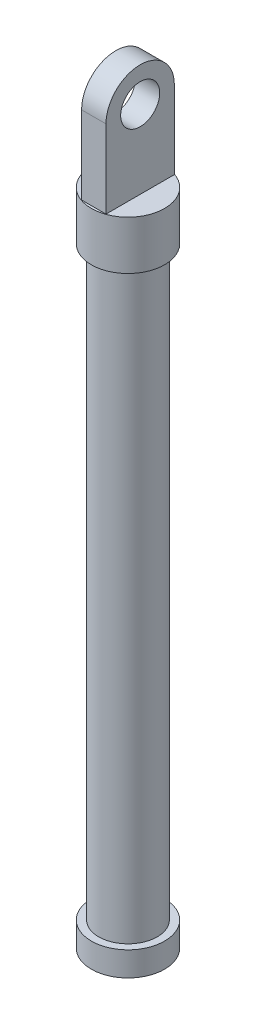
ISO-10303-21;
HEADER;
FILE_DESCRIPTION(('STEP AP214'),'2;1');
FILE_NAME('part.step','',(''),(''),'','','');
FILE_SCHEMA(('AUTOMOTIVE_DESIGN { 1 0 10303 214 1 1 1 1 }'));
ENDSEC;
DATA;
#1=APPLICATION_CONTEXT('core data for automotive mechanical design processes');
#2=APPLICATION_PROTOCOL_DEFINITION('international standard','automotive_design',2000,#1);
#3=PRODUCT_CONTEXT('',#1,'mechanical');
#4=PRODUCT('Part','Part','',(#3));
#5=PRODUCT_RELATED_PRODUCT_CATEGORY('part','',(#4));
#6=PRODUCT_DEFINITION_FORMATION('','',#4);
#7=PRODUCT_DEFINITION_CONTEXT('part definition',#1,'design');
#8=PRODUCT_DEFINITION('design','',#6,#7);
#9=PRODUCT_DEFINITION_SHAPE('','',#8);
#10=(LENGTH_UNIT() NAMED_UNIT(*) SI_UNIT(.MILLI.,.METRE.));
#11=(NAMED_UNIT(*) PLANE_ANGLE_UNIT() SI_UNIT($,.RADIAN.));
#12=(NAMED_UNIT(*) SI_UNIT($,.STERADIAN.) SOLID_ANGLE_UNIT());
#13=UNCERTAINTY_MEASURE_WITH_UNIT(LENGTH_MEASURE(1.E-05),#10,'distance_accuracy_value','');
#14=(GEOMETRIC_REPRESENTATION_CONTEXT(3) GLOBAL_UNCERTAINTY_ASSIGNED_CONTEXT((#13)) GLOBAL_UNIT_ASSIGNED_CONTEXT((#10,
#11,#12)) REPRESENTATION_CONTEXT('',''));
#15=CARTESIAN_POINT('',(0.,0.,0.));
#16=DIRECTION('',(0.,0.,1.));
#17=DIRECTION('',(1.,0.,0.));
#18=AXIS2_PLACEMENT_3D('',#15,#16,#17);
#19=CARTESIAN_POINT('',(0.,135.,0.));
#20=DIRECTION('',(0.,-1.,0.));
#21=DIRECTION('',(0.,0.,-1.));
#22=AXIS2_PLACEMENT_3D('',#19,#20,#21);
#23=CYLINDRICAL_SURFACE('',#22,6.);
#24=CARTESIAN_POINT('',(0.,5.,0.));
#25=DIRECTION('',(0.,1.,0.));
#26=DIRECTION('',(0.,0.,1.));
#27=AXIS2_PLACEMENT_3D('',#24,#25,#26);
#28=CIRCLE('',#27,6.);
#29=CARTESIAN_POINT('',(0.,5.,6.));
#30=VERTEX_POINT('',#29);
#31=EDGE_CURVE('E123',#30,#30,#28,.T.);
#32=ORIENTED_EDGE('',*,*,#31,.T.);
#33=EDGE_LOOP('',(#32));
#34=FACE_BOUND('',#33,.T.);
#35=CARTESIAN_POINT('',(0.,125.,0.));
#36=DIRECTION('',(0.,1.,0.));
#37=DIRECTION('',(0.,0.,1.));
#38=AXIS2_PLACEMENT_3D('',#35,#36,#37);
#39=CIRCLE('',#38,6.);
#40=CARTESIAN_POINT('',(0.,125.,6.));
#41=VERTEX_POINT('',#40);
#42=EDGE_CURVE('E11',#41,#41,#39,.T.);
#43=ORIENTED_EDGE('',*,*,#42,.F.);
#44=EDGE_LOOP('',(#43));
#45=FACE_BOUND('',#44,.T.);
#46=ADVANCED_FACE('F39',(#34,#45),#23,.T.);
#47=CARTESIAN_POINT('',(0.,5.,0.));
#48=DIRECTION('',(0.,-1.,0.));
#49=DIRECTION('',(0.,0.,-1.));
#50=AXIS2_PLACEMENT_3D('',#47,#48,#49);
#51=CYLINDRICAL_SURFACE('',#50,7.5);
#52=CARTESIAN_POINT('',(0.,5.,0.));
#53=DIRECTION('',(0.,1.,0.));
#54=DIRECTION('',(0.,0.,1.));
#55=AXIS2_PLACEMENT_3D('',#52,#53,#54);
#56=CIRCLE('',#55,7.5);
#57=CARTESIAN_POINT('',(0.,5.,7.5));
#58=VERTEX_POINT('',#57);
#59=EDGE_CURVE('E127',#58,#58,#56,.T.);
#60=ORIENTED_EDGE('',*,*,#59,.F.);
#61=EDGE_LOOP('',(#60));
#62=FACE_BOUND('',#61,.T.);
#63=CARTESIAN_POINT('',(0.,0.,0.));
#64=DIRECTION('',(0.,1.,0.));
#65=DIRECTION('',(0.,0.,1.));
#66=AXIS2_PLACEMENT_3D('',#63,#64,#65);
#67=CIRCLE('',#66,7.5);
#68=CARTESIAN_POINT('',(0.,0.,7.5));
#69=VERTEX_POINT('',#68);
#70=EDGE_CURVE('E122',#69,#69,#67,.T.);
#71=ORIENTED_EDGE('',*,*,#70,.T.);
#72=EDGE_LOOP('',(#71));
#73=FACE_BOUND('',#72,.T.);
#74=ADVANCED_FACE('F41',(#62,#73),#51,.T.);
#75=CARTESIAN_POINT('',(0.,5.,0.));
#76=DIRECTION('',(0.,1.,0.));
#77=DIRECTION('',(0.,0.,1.));
#78=AXIS2_PLACEMENT_3D('',#75,#76,#77);
#79=PLANE('',#78);
#80=ORIENTED_EDGE('',*,*,#31,.F.);
#81=EDGE_LOOP('',(#80));
#82=FACE_BOUND('',#81,.T.);
#83=ORIENTED_EDGE('',*,*,#59,.T.);
#84=EDGE_LOOP('',(#83));
#85=FACE_BOUND('',#84,.T.);
#86=ADVANCED_FACE('F138',(#82,#85),#79,.T.);
#87=CARTESIAN_POINT('',(0.,0.,0.));
#88=DIRECTION('',(0.,1.,0.));
#89=DIRECTION('',(0.,0.,1.));
#90=AXIS2_PLACEMENT_3D('',#87,#88,#89);
#91=PLANE('',#90);
#92=ORIENTED_EDGE('',*,*,#70,.F.);
#93=EDGE_LOOP('',(#92));
#94=FACE_BOUND('',#93,.T.);
#95=ADVANCED_FACE('F135',(#94),#91,.F.);
#96=CARTESIAN_POINT('',(0.,125.,0.));
#97=DIRECTION('',(0.,1.,0.));
#98=DIRECTION('',(0.,0.,1.));
#99=AXIS2_PLACEMENT_3D('',#96,#97,#98);
#100=CYLINDRICAL_SURFACE('',#99,7.5);
#101=CARTESIAN_POINT('',(0.,125.,0.));
#102=DIRECTION('',(0.,1.,0.));
#103=DIRECTION('',(0.,0.,1.));
#104=AXIS2_PLACEMENT_3D('',#101,#102,#103);
#105=CIRCLE('',#104,7.5);
#106=CARTESIAN_POINT('',(0.,125.,7.5));
#107=VERTEX_POINT('',#106);
#108=EDGE_CURVE('E185',#107,#107,#105,.T.);
#109=ORIENTED_EDGE('',*,*,#108,.T.);
#110=EDGE_LOOP('',(#109));
#111=FACE_BOUND('',#110,.T.);
#112=CARTESIAN_POINT('',(0.,135.,0.));
#113=DIRECTION('',(0.,1.,0.));
#114=DIRECTION('',(0.,0.,1.));
#115=AXIS2_PLACEMENT_3D('',#112,#113,#114);
#116=CIRCLE('',#115,7.5);
#117=CARTESIAN_POINT('',(0.,135.,7.5));
#118=VERTEX_POINT('',#117);
#119=EDGE_CURVE('E187',#118,#118,#116,.T.);
#120=ORIENTED_EDGE('',*,*,#119,.F.);
#121=EDGE_LOOP('',(#120));
#122=FACE_BOUND('',#121,.T.);
#123=ADVANCED_FACE('F137',(#111,#122),#100,.T.);
#124=CARTESIAN_POINT('',(0.,125.,0.));
#125=DIRECTION('',(0.,1.,0.));
#126=DIRECTION('',(0.,0.,1.));
#127=AXIS2_PLACEMENT_3D('',#124,#125,#126);
#128=PLANE('',#127);
#129=ORIENTED_EDGE('',*,*,#42,.T.);
#130=EDGE_LOOP('',(#129));
#131=FACE_BOUND('',#130,.T.);
#132=ORIENTED_EDGE('',*,*,#108,.F.);
#133=EDGE_LOOP('',(#132));
#134=FACE_BOUND('',#133,.T.);
#135=ADVANCED_FACE('F143',(#131,#134),#128,.F.);
#136=CARTESIAN_POINT('',(2.5,151.,0.));
#137=DIRECTION('',(-1.,0.,0.));
#138=DIRECTION('',(0.,0.,1.));
#139=AXIS2_PLACEMENT_3D('',#136,#137,#138);
#140=CYLINDRICAL_SURFACE('',#139,4.);
#141=CARTESIAN_POINT('',(2.5,151.,0.));
#142=DIRECTION('',(1.,0.,0.));
#143=DIRECTION('',(0.,0.,-1.));
#144=AXIS2_PLACEMENT_3D('',#141,#142,#143);
#145=CIRCLE('',#144,4.);
#146=CARTESIAN_POINT('',(2.5,151.,-3.99999999999998));
#147=VERTEX_POINT('',#146);
#148=EDGE_CURVE('E100',#147,#147,#145,.T.);
#149=ORIENTED_EDGE('',*,*,#148,.T.);
#150=EDGE_LOOP('',(#149));
#151=FACE_BOUND('',#150,.T.);
#152=CARTESIAN_POINT('',(-2.5,151.,0.));
#153=DIRECTION('',(1.,0.,0.));
#154=DIRECTION('',(0.,0.,-1.));
#155=AXIS2_PLACEMENT_3D('',#152,#153,#154);
#156=CIRCLE('',#155,4.);
#157=CARTESIAN_POINT('',(-2.5,151.,-3.99999999999998));
#158=VERTEX_POINT('',#157);
#159=EDGE_CURVE('E106',#158,#158,#156,.T.);
#160=ORIENTED_EDGE('',*,*,#159,.F.);
#161=EDGE_LOOP('',(#160));
#162=FACE_BOUND('',#161,.T.);
#163=ADVANCED_FACE('F164',(#151,#162),#140,.F.);
#164=CARTESIAN_POINT('',(2.5,151.,0.));
#165=DIRECTION('',(-1.,0.,0.));
#166=DIRECTION('',(0.,0.,1.));
#167=AXIS2_PLACEMENT_3D('',#164,#165,#166);
#168=CYLINDRICAL_SURFACE('',#167,7.);
#169=CARTESIAN_POINT('',(-2.5,151.,0.));
#170=DIRECTION('',(1.,0.,0.));
#171=DIRECTION('',(0.,0.,-1.));
#172=AXIS2_PLACEMENT_3D('',#169,#170,#171);
#173=CIRCLE('',#172,7.);
#174=CARTESIAN_POINT('',(-2.5,151.,-7.));
#175=VERTEX_POINT('',#174);
#176=CARTESIAN_POINT('',(-2.5,151.,7.));
#177=VERTEX_POINT('',#176);
#178=EDGE_CURVE('E92',#175,#177,#173,.T.);
#179=ORIENTED_EDGE('',*,*,#178,.T.);
#180=DIRECTION('',(-1.,0.,0.));
#181=VECTOR('',#180,1.);
#182=CARTESIAN_POINT('',(2.5,151.,7.));
#183=LINE('',#182,#181);
#184=CARTESIAN_POINT('',(2.5,151.,7.));
#185=VERTEX_POINT('',#184);
#186=EDGE_CURVE('E119',#185,#177,#183,.T.);
#187=ORIENTED_EDGE('',*,*,#186,.F.);
#188=CARTESIAN_POINT('',(2.5,151.,0.));
#189=DIRECTION('',(1.,0.,0.));
#190=DIRECTION('',(0.,0.,-1.));
#191=AXIS2_PLACEMENT_3D('',#188,#189,#190);
#192=CIRCLE('',#191,7.);
#193=CARTESIAN_POINT('',(2.5,151.,-7.));
#194=VERTEX_POINT('',#193);
#195=EDGE_CURVE('E85',#194,#185,#192,.T.);
#196=ORIENTED_EDGE('',*,*,#195,.F.);
#197=DIRECTION('',(-1.,0.,0.));
#198=VECTOR('',#197,1.);
#199=CARTESIAN_POINT('',(2.5,151.,-7.));
#200=LINE('',#199,#198);
#201=EDGE_CURVE('E79',#194,#175,#200,.T.);
#202=ORIENTED_EDGE('',*,*,#201,.T.);
#203=EDGE_LOOP('',(#179,#187,#196,#202));
#204=FACE_BOUND('',#203,.T.);
#205=ADVANCED_FACE('F90',(#204),#168,.T.);
#206=CARTESIAN_POINT('',(2.5,151.,7.));
#207=DIRECTION('',(0.,0.,-1.));
#208=DIRECTION('',(0.,1.,0.));
#209=AXIS2_PLACEMENT_3D('',#206,#207,#208);
#210=PLANE('',#209);
#211=DIRECTION('',(0.,-1.,0.));
#212=VECTOR('',#211,1.);
#213=CARTESIAN_POINT('',(-2.5,151.,7.));
#214=LINE('',#213,#212);
#215=CARTESIAN_POINT('',(-2.5,135.,7.00000000000002));
#216=VERTEX_POINT('',#215);
#217=EDGE_CURVE('E86',#177,#216,#214,.T.);
#218=ORIENTED_EDGE('',*,*,#217,.T.);
#219=DIRECTION('',(-1.,0.,0.));
#220=VECTOR('',#219,1.);
#221=CARTESIAN_POINT('',(2.5,135.,7.));
#222=LINE('',#221,#220);
#223=CARTESIAN_POINT('',(2.5,135.,7.));
#224=VERTEX_POINT('',#223);
#225=EDGE_CURVE('E116',#224,#216,#222,.T.);
#226=ORIENTED_EDGE('',*,*,#225,.F.);
#227=DIRECTION('',(0.,-1.,0.));
#228=VECTOR('',#227,1.);
#229=CARTESIAN_POINT('',(2.5,151.,7.));
#230=LINE('',#229,#228);
#231=EDGE_CURVE('E198',#185,#224,#230,.T.);
#232=ORIENTED_EDGE('',*,*,#231,.F.);
#233=ORIENTED_EDGE('',*,*,#186,.T.);
#234=EDGE_LOOP('',(#218,#226,#232,#233));
#235=FACE_BOUND('',#234,.T.);
#236=ADVANCED_FACE('F163',(#235),#210,.F.);
#237=CARTESIAN_POINT('',(2.5,151.,-7.));
#238=DIRECTION('',(0.,0.,1.));
#239=DIRECTION('',(0.,-1.,0.));
#240=AXIS2_PLACEMENT_3D('',#237,#238,#239);
#241=PLANE('',#240);
#242=DIRECTION('',(0.,1.,0.));
#243=VECTOR('',#242,1.);
#244=CARTESIAN_POINT('',(-2.5,151.,-7.));
#245=LINE('',#244,#243);
#246=CARTESIAN_POINT('',(-2.5,135.,-7.));
#247=VERTEX_POINT('',#246);
#248=EDGE_CURVE('E76',#247,#175,#245,.T.);
#249=ORIENTED_EDGE('',*,*,#248,.T.);
#250=ORIENTED_EDGE('',*,*,#201,.F.);
#251=DIRECTION('',(0.,1.,0.));
#252=VECTOR('',#251,1.);
#253=CARTESIAN_POINT('',(2.5,151.,-7.));
#254=LINE('',#253,#252);
#255=CARTESIAN_POINT('',(2.5,135.,-7.));
#256=VERTEX_POINT('',#255);
#257=EDGE_CURVE('E57',#256,#194,#254,.T.);
#258=ORIENTED_EDGE('',*,*,#257,.F.);
#259=DIRECTION('',(-1.,0.,0.));
#260=VECTOR('',#259,1.);
#261=CARTESIAN_POINT('',(2.5,135.,-7.));
#262=LINE('',#261,#260);
#263=EDGE_CURVE('E81',#256,#247,#262,.T.);
#264=ORIENTED_EDGE('',*,*,#263,.T.);
#265=EDGE_LOOP('',(#249,#250,#258,#264));
#266=FACE_BOUND('',#265,.T.);
#267=ADVANCED_FACE('F78',(#266),#241,.F.);
#268=CARTESIAN_POINT('',(-2.5,151.,0.));
#269=DIRECTION('',(1.,0.,0.));
#270=DIRECTION('',(0.,0.,-1.));
#271=AXIS2_PLACEMENT_3D('',#268,#269,#270);
#272=PLANE('',#271);
#273=ORIENTED_EDGE('',*,*,#178,.F.);
#274=ORIENTED_EDGE('',*,*,#248,.F.);
#275=DIRECTION('',(0.,0.,-1.));
#276=VECTOR('',#275,1.);
#277=CARTESIAN_POINT('',(-2.5,135.,-7.));
#278=LINE('',#277,#276);
#279=EDGE_CURVE('E49',#216,#247,#278,.T.);
#280=ORIENTED_EDGE('',*,*,#279,.F.);
#281=ORIENTED_EDGE('',*,*,#217,.F.);
#282=EDGE_LOOP('',(#273,#274,#280,#281));
#283=FACE_BOUND('',#282,.T.);
#284=ORIENTED_EDGE('',*,*,#159,.T.);
#285=EDGE_LOOP('',(#284));
#286=FACE_BOUND('',#285,.T.);
#287=ADVANCED_FACE('F95',(#283,#286),#272,.F.);
#288=CARTESIAN_POINT('',(2.5,151.,0.));
#289=DIRECTION('',(1.,0.,0.));
#290=DIRECTION('',(0.,0.,-1.));
#291=AXIS2_PLACEMENT_3D('',#288,#289,#290);
#292=PLANE('',#291);
#293=ORIENTED_EDGE('',*,*,#195,.T.);
#294=ORIENTED_EDGE('',*,*,#231,.T.);
#295=DIRECTION('',(0.,0.,-1.));
#296=VECTOR('',#295,1.);
#297=CARTESIAN_POINT('',(2.5,135.,-7.));
#298=LINE('',#297,#296);
#299=EDGE_CURVE('E112',#224,#256,#298,.T.);
#300=ORIENTED_EDGE('',*,*,#299,.T.);
#301=ORIENTED_EDGE('',*,*,#257,.T.);
#302=EDGE_LOOP('',(#293,#294,#300,#301));
#303=FACE_BOUND('',#302,.T.);
#304=ORIENTED_EDGE('',*,*,#148,.F.);
#305=EDGE_LOOP('',(#304));
#306=FACE_BOUND('',#305,.T.);
#307=ADVANCED_FACE('F160',(#303,#306),#292,.T.);
#308=CARTESIAN_POINT('',(0.,135.,0.));
#309=DIRECTION('',(0.,1.,0.));
#310=DIRECTION('',(0.,0.,1.));
#311=AXIS2_PLACEMENT_3D('',#308,#309,#310);
#312=PLANE('',#311);
#313=ORIENTED_EDGE('',*,*,#299,.F.);
#314=ORIENTED_EDGE('',*,*,#225,.T.);
#315=ORIENTED_EDGE('',*,*,#279,.T.);
#316=ORIENTED_EDGE('',*,*,#263,.F.);
#317=EDGE_LOOP('',(#313,#314,#315,#316));
#318=FACE_BOUND('',#317,.T.);
#319=ORIENTED_EDGE('',*,*,#119,.T.);
#320=EDGE_LOOP('',(#319));
#321=FACE_BOUND('',#320,.T.);
#322=ADVANCED_FACE('F157',(#318,#321),#312,.T.);
#323=CLOSED_SHELL('',(#46,#74,#86,#95,#123,#135,#163,#205,#236,#267,#287,#307,#322));
#324=MANIFOLD_SOLID_BREP('B2',#323);
#325=ADVANCED_BREP_SHAPE_REPRESENTATION('',(#18,#324),#14);
#326=SHAPE_DEFINITION_REPRESENTATION(#9,#325);
ENDSEC;
END-ISO-10303-21;
